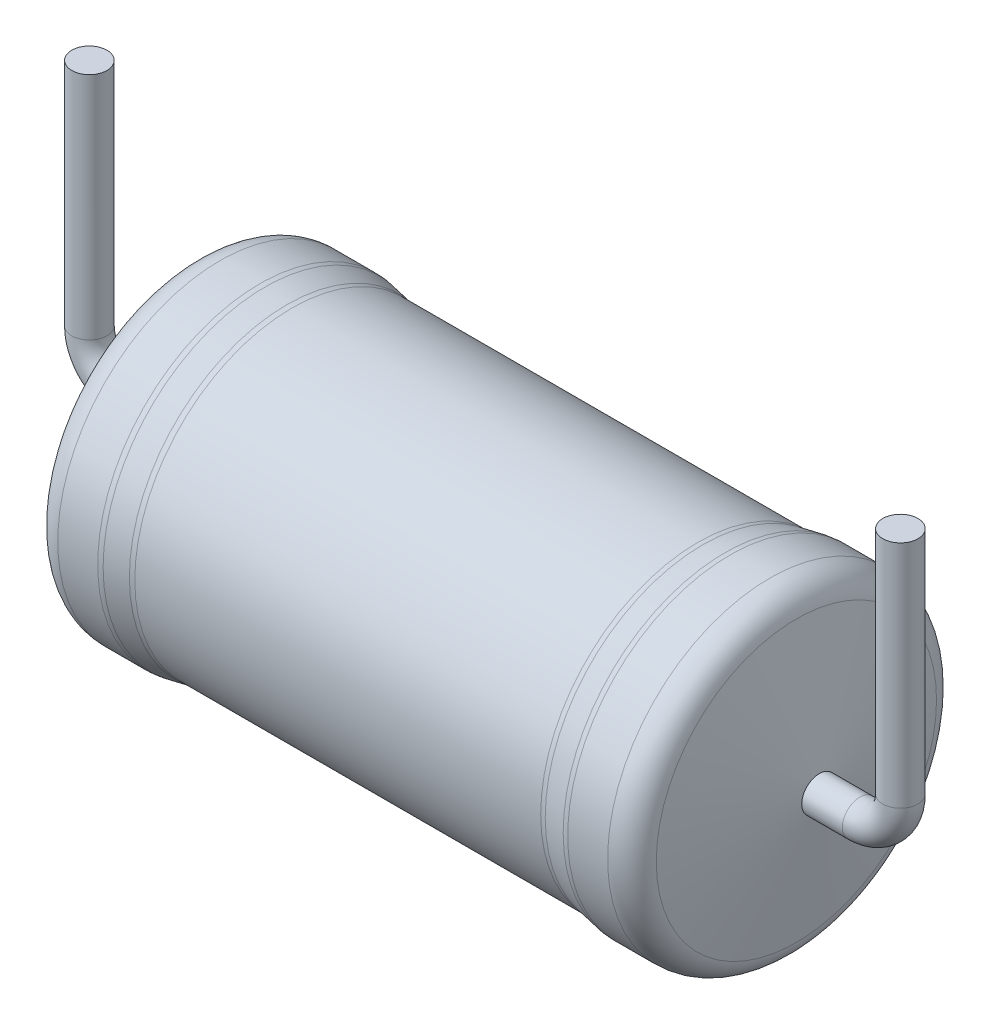
ISO-10303-21;
HEADER;
FILE_DESCRIPTION(('STEP AP214'),'2;1');
FILE_NAME('part.step','',(''),(''),'','','');
FILE_SCHEMA(('AUTOMOTIVE_DESIGN { 1 0 10303 214 1 1 1 1 }'));
ENDSEC;
DATA;
#1=APPLICATION_CONTEXT('core data for automotive mechanical design processes');
#2=APPLICATION_PROTOCOL_DEFINITION('international standard','automotive_design',2000,#1);
#3=PRODUCT_CONTEXT('',#1,'mechanical');
#4=PRODUCT('Part','Part','',(#3));
#5=PRODUCT_RELATED_PRODUCT_CATEGORY('part','',(#4));
#6=PRODUCT_DEFINITION_FORMATION('','',#4);
#7=PRODUCT_DEFINITION_CONTEXT('part definition',#1,'design');
#8=PRODUCT_DEFINITION('design','',#6,#7);
#9=PRODUCT_DEFINITION_SHAPE('','',#8);
#10=(LENGTH_UNIT() NAMED_UNIT(*) SI_UNIT(.MILLI.,.METRE.));
#11=(NAMED_UNIT(*) PLANE_ANGLE_UNIT() SI_UNIT($,.RADIAN.));
#12=(NAMED_UNIT(*) SI_UNIT($,.STERADIAN.) SOLID_ANGLE_UNIT());
#13=UNCERTAINTY_MEASURE_WITH_UNIT(LENGTH_MEASURE(1.E-05),#10,'distance_accuracy_value','');
#14=(GEOMETRIC_REPRESENTATION_CONTEXT(3) GLOBAL_UNCERTAINTY_ASSIGNED_CONTEXT((#13)) GLOBAL_UNIT_ASSIGNED_CONTEXT((#10,
#11,#12)) REPRESENTATION_CONTEXT('',''));
#15=CARTESIAN_POINT('',(0.,0.,0.));
#16=DIRECTION('',(0.,0.,1.));
#17=DIRECTION('',(1.,0.,0.));
#18=AXIS2_PLACEMENT_3D('',#15,#16,#17);
#19=CARTESIAN_POINT('',(6.,0.,0.));
#20=DIRECTION('',(-1.,0.,0.));
#21=DIRECTION('',(0.,0.,1.));
#22=AXIS2_PLACEMENT_3D('',#19,#20,#21);
#23=CONICAL_SURFACE('',#22,0.325,1.38601271082507);
#24=CARTESIAN_POINT('',(5.5762865572415,0.,0.));
#25=DIRECTION('',(1.,0.,0.));
#26=DIRECTION('',(0.,0.,-1.));
#27=AXIS2_PLACEMENT_3D('',#24,#25,#26);
#28=CIRCLE('',#27,2.591866918758);
#29=CARTESIAN_POINT('',(5.5762865572415,0.,2.59186691875801));
#30=VERTEX_POINT('',#29);
#31=EDGE_CURVE('E11',#30,#30,#28,.T.);
#32=CARTESIAN_POINT('',(6.,0.,0.));
#33=DIRECTION('',(-1.,0.,0.));
#34=DIRECTION('',(0.,0.,1.));
#35=AXIS2_PLACEMENT_3D('',#32,#33,#34);
#36=CIRCLE('',#35,0.325);
#37=CARTESIAN_POINT('',(6.,0.,0.324999999999998));
#38=VERTEX_POINT('',#37);
#39=EDGE_CURVE('E61',#38,#38,#36,.T.);
#40=CARTESIAN_POINT('',(5.5762865572415,0.,2.59186691875801));
#41=CARTESIAN_POINT('',(5.5807002389369,0.,2.56825372168761));
#42=CARTESIAN_POINT('',(5.5851139206323,0.,2.54464052461722));
#43=CARTESIAN_POINT('',(5.5939412840231,0.,2.49741413047642));
#44=CARTESIAN_POINT('',(5.5983549657185,0.,2.47380093340603));
#45=CARTESIAN_POINT('',(5.6071823291093,0.,2.42657453926524));
#46=CARTESIAN_POINT('',(5.61159601080471,0.,2.40296134219484));
#47=CARTESIAN_POINT('',(5.62042337419551,0.,2.35573494805405));
#48=CARTESIAN_POINT('',(5.62483705589091,0.,2.33212175098365));
#49=CARTESIAN_POINT('',(5.63366441928171,0.,2.28489535684286));
#50=CARTESIAN_POINT('',(5.63807810097711,0.,2.26128215977246));
#51=CARTESIAN_POINT('',(5.64690546436791,0.,2.21405576563167));
#52=CARTESIAN_POINT('',(5.65131914606332,0.,2.19044256856128));
#53=CARTESIAN_POINT('',(5.66014650945412,0.,2.14321617442048));
#54=CARTESIAN_POINT('',(5.66456019114952,0.,2.11960297735009));
#55=CARTESIAN_POINT('',(5.67338755454032,0.,2.0723765832093));
#56=CARTESIAN_POINT('',(5.67780123623572,0.,2.0487633861389));
#57=CARTESIAN_POINT('',(5.68662859962652,0.,2.00153699199811));
#58=CARTESIAN_POINT('',(5.69104228132192,0.,1.97792379492771));
#59=CARTESIAN_POINT('',(5.69986964471273,0.,1.93069740078692));
#60=CARTESIAN_POINT('',(5.70428332640813,0.,1.90708420371652));
#61=CARTESIAN_POINT('',(5.71311068979893,0.,1.85985780957573));
#62=CARTESIAN_POINT('',(5.71752437149433,0.,1.83624461250534));
#63=CARTESIAN_POINT('',(5.72635173488513,0.,1.78901821836455));
#64=CARTESIAN_POINT('',(5.73076541658053,0.,1.76540502129415));
#65=CARTESIAN_POINT('',(5.73959277997134,0.,1.71817862715336));
#66=CARTESIAN_POINT('',(5.74400646166674,0.,1.69456543008296));
#67=CARTESIAN_POINT('',(5.75283382505754,0.,1.64733903594217));
#68=CARTESIAN_POINT('',(5.75724750675294,0.,1.62372583887177));
#69=CARTESIAN_POINT('',(5.76607487014374,0.,1.57649944473098));
#70=CARTESIAN_POINT('',(5.77048855183915,0.,1.55288624766059));
#71=CARTESIAN_POINT('',(5.77931591522995,0.,1.50565985351979));
#72=CARTESIAN_POINT('',(5.78372959692535,0.,1.4820466564494));
#73=CARTESIAN_POINT('',(5.79255696031615,0.,1.43482026230861));
#74=CARTESIAN_POINT('',(5.79697064201155,0.,1.41120706523821));
#75=CARTESIAN_POINT('',(5.80579800540235,0.,1.36398067109742));
#76=CARTESIAN_POINT('',(5.81021168709776,0.,1.34036747402702));
#77=CARTESIAN_POINT('',(5.81903905048856,0.,1.29314107988623));
#78=CARTESIAN_POINT('',(5.82345273218396,0.,1.26952788281583));
#79=CARTESIAN_POINT('',(5.83228009557476,0.,1.22230148867504));
#80=CARTESIAN_POINT('',(5.83669377727016,0.,1.19868829160465));
#81=CARTESIAN_POINT('',(5.84552114066097,0.,1.15146189746386));
#82=CARTESIAN_POINT('',(5.84993482235637,0.,1.12784870039346));
#83=CARTESIAN_POINT('',(5.85876218574717,0.,1.08062230625267));
#84=CARTESIAN_POINT('',(5.86317586744257,0.,1.05700910918227));
#85=CARTESIAN_POINT('',(5.87200323083337,0.,1.00978271504148));
#86=CARTESIAN_POINT('',(5.87641691252877,0.,0.986169517971084));
#87=CARTESIAN_POINT('',(5.88524427591958,0.,0.938943123830292));
#88=CARTESIAN_POINT('',(5.88965795761498,0.,0.915329926759896));
#89=CARTESIAN_POINT('',(5.89848532100578,0.,0.868103532619104));
#90=CARTESIAN_POINT('',(5.90289900270118,0.,0.844490335548708));
#91=CARTESIAN_POINT('',(5.91172636609198,0.,0.797263941407916));
#92=CARTESIAN_POINT('',(5.91614004778738,0.,0.77365074433752));
#93=CARTESIAN_POINT('',(5.92496741117818,0.,0.726424350196728));
#94=CARTESIAN_POINT('',(5.92938109287359,0.,0.702811153126333));
#95=CARTESIAN_POINT('',(5.93820845626439,0.,0.655584758985541));
#96=CARTESIAN_POINT('',(5.94262213795979,0.,0.631971561915145));
#97=CARTESIAN_POINT('',(5.95144950135059,0.,0.584745167774353));
#98=CARTESIAN_POINT('',(5.95586318304599,0.,0.561131970703957));
#99=CARTESIAN_POINT('',(5.96469054643679,0.,0.513905576563165));
#100=CARTESIAN_POINT('',(5.9691042281322,0.,0.490292379492769));
#101=CARTESIAN_POINT('',(5.977931591523,0.,0.443065985351977));
#102=CARTESIAN_POINT('',(5.9823452732184,0.,0.419452788281582));
#103=CARTESIAN_POINT('',(5.9911726366092,0.,0.37222639414079));
#104=CARTESIAN_POINT('',(5.9955863183046,0.,0.348613197070394));
#105=CARTESIAN_POINT('',(6.,0.,0.324999999999998));
#106=B_SPLINE_CURVE_WITH_KNOTS('',3,(#40,#41,#42,#43,#44,#45,#46,#47,#48,#49,#50,#51,#52,#53,
#54,#55,#56,#57,#58,#59,#60,#61,#62,#63,#64,#65,#66,#67,#68,#69,#70,#71,#72,#73,#74,#75,#76,#77,
#78,#79,#80,#81,#82,#83,#84,#85,#86,#87,#88,#89,#90,#91,#92,#93,#94,#95,#96,#97,#98,#99,#100,
#101,#102,#103,#104,#105),.UNSPECIFIED.,.F.,.F.,(4,2,2,2,2,2,2,2,2,2,2,2,2,2,2,2,2,2,2,2,2,2,2,
2,2,2,2,2,2,2,2,2,4),(0.,0.0720664482123484,0.144132896424697,0.216199344637045,
0.288265792849393,0.360332241061741,0.43239868927409,0.504465137486438,0.576531585698786,
0.648598033911134,0.720664482123483,0.79273093033583,0.864797378548179,0.936863826760527,
1.00893027497288,1.08099672318522,1.15306317139757,1.22512961960992,1.29719606782227,
1.36926251603462,1.44132896424696,1.51339541245931,1.58546186067166,1.65752830888401,
1.72959475709636,1.80166120530871,1.87372765352105,1.9457941017334,2.01786054994575,
2.0899269981581,2.16199344637045,2.23405989458279,2.30612634279514),.UNSPECIFIED.);
#107=EDGE_CURVE('BSEAM39',#30,#38,#106,.T.);
#108=ORIENTED_EDGE('',*,*,#31,.T.);
#109=ORIENTED_EDGE('',*,*,#39,.T.);
#110=ORIENTED_EDGE('',*,*,#107,.T.);
#111=ORIENTED_EDGE('',*,*,#107,.F.);
#112=EDGE_LOOP('',(#108,#110,#109,#111));
#113=FACE_BOUND('',#112,.T.);
#114=ADVANCED_FACE('F39',(#113),#23,.T.);
#115=CARTESIAN_POINT('',(0.,0.,0.));
#116=DIRECTION('',(-1.,0.,0.));
#117=DIRECTION('',(0.,0.,1.));
#118=AXIS2_PLACEMENT_3D('',#115,#116,#117);
#119=CYLINDRICAL_SURFACE('',#118,3.);
#120=CARTESIAN_POINT('',(4.34632780090896,0.,0.));
#121=DIRECTION('',(1.,0.,0.));
#122=DIRECTION('',(0.,0.,-1.));
#123=AXIS2_PLACEMENT_3D('',#120,#121,#122);
#124=CIRCLE('',#123,3.);
#125=CARTESIAN_POINT('',(4.34632780090896,0.,-3.));
#126=VERTEX_POINT('',#125);
#127=EDGE_CURVE('E48',#126,#126,#124,.T.);
#128=ORIENTED_EDGE('',*,*,#127,.T.);
#129=EDGE_LOOP('',(#128));
#130=FACE_BOUND('',#129,.T.);
#131=CARTESIAN_POINT('',(5.08479854188618,0.,0.));
#132=DIRECTION('',(1.,0.,0.));
#133=DIRECTION('',(0.,0.,-1.));
#134=AXIS2_PLACEMENT_3D('',#131,#132,#133);
#135=CIRCLE('',#134,3.);
#136=CARTESIAN_POINT('',(5.08479854188618,0.,-3.));
#137=VERTEX_POINT('',#136);
#138=EDGE_CURVE('E113',#137,#137,#135,.F.);
#139=ORIENTED_EDGE('',*,*,#138,.T.);
#140=EDGE_LOOP('',(#139));
#141=FACE_BOUND('',#140,.T.);
#142=ADVANCED_FACE('F120',(#130,#141),#119,.T.);
#143=CARTESIAN_POINT('',(4.3,0.,0.));
#144=DIRECTION('',(1.,0.,0.));
#145=DIRECTION('',(0.,0.,-1.));
#146=AXIS2_PLACEMENT_3D('',#143,#144,#145);
#147=CONICAL_SURFACE('',#146,3.,0.184783615969826);
#148=CARTESIAN_POINT('',(3.84553911784905,0.,0.));
#149=DIRECTION('',(1.,0.,0.));
#150=DIRECTION('',(0.,0.,-1.));
#151=AXIS2_PLACEMENT_3D('',#148,#149,#150);
#152=CIRCLE('',#151,2.91505404071945);
#153=CARTESIAN_POINT('',(3.84553911784905,0.,-2.91505404071945));
#154=VERTEX_POINT('',#153);
#155=EDGE_CURVE('E109',#154,#154,#152,.T.);
#156=ORIENTED_EDGE('',*,*,#155,.T.);
#157=EDGE_LOOP('',(#156));
#158=FACE_BOUND('',#157,.T.);
#159=CARTESIAN_POINT('',(4.25446088215096,0.,0.));
#160=DIRECTION('',(-1.,0.,0.));
#161=DIRECTION('',(0.,0.,1.));
#162=AXIS2_PLACEMENT_3D('',#159,#160,#161);
#163=CIRCLE('',#162,2.99148801535532);
#164=CARTESIAN_POINT('',(4.25446088215096,0.,2.99148801535532));
#165=VERTEX_POINT('',#164);
#166=EDGE_CURVE('E105',#165,#165,#163,.T.);
#167=ORIENTED_EDGE('',*,*,#166,.T.);
#168=EDGE_LOOP('',(#167));
#169=FACE_BOUND('',#168,.T.);
#170=ADVANCED_FACE('F129',(#158,#169),#147,.T.);
#171=CARTESIAN_POINT('',(0.,0.,0.));
#172=DIRECTION('',(-1.,0.,0.));
#173=DIRECTION('',(0.,0.,1.));
#174=AXIS2_PLACEMENT_3D('',#171,#172,#173);
#175=CYLINDRICAL_SURFACE('',#174,2.90654205607477);
#176=CARTESIAN_POINT('',(-3.75367219909104,0.,0.));
#177=DIRECTION('',(-1.,0.,0.));
#178=DIRECTION('',(0.,0.,1.));
#179=AXIS2_PLACEMENT_3D('',#176,#177,#178);
#180=CIRCLE('',#179,2.90654205607477);
#181=CARTESIAN_POINT('',(-3.75367219909104,0.,2.90654205607477));
#182=VERTEX_POINT('',#181);
#183=EDGE_CURVE('E101',#182,#182,#180,.F.);
#184=ORIENTED_EDGE('',*,*,#183,.T.);
#185=EDGE_LOOP('',(#184));
#186=FACE_BOUND('',#185,.T.);
#187=CARTESIAN_POINT('',(3.75367219909104,0.,0.));
#188=DIRECTION('',(-1.,0.,0.));
#189=DIRECTION('',(0.,0.,1.));
#190=AXIS2_PLACEMENT_3D('',#187,#188,#189);
#191=CIRCLE('',#190,2.90654205607477);
#192=CARTESIAN_POINT('',(3.75367219909104,0.,2.90654205607477));
#193=VERTEX_POINT('',#192);
#194=EDGE_CURVE('E97',#193,#193,#191,.T.);
#195=ORIENTED_EDGE('',*,*,#194,.T.);
#196=EDGE_LOOP('',(#195));
#197=FACE_BOUND('',#196,.T.);
#198=ADVANCED_FACE('F131',(#186,#197),#175,.T.);
#199=CARTESIAN_POINT('',(-3.8,0.,0.));
#200=DIRECTION('',(-1.,0.,0.));
#201=DIRECTION('',(0.,0.,1.));
#202=AXIS2_PLACEMENT_3D('',#199,#200,#201);
#203=CONICAL_SURFACE('',#202,2.90654205607477,0.184783615969825);
#204=CARTESIAN_POINT('',(-4.25446088215095,0.,0.));
#205=DIRECTION('',(1.,0.,0.));
#206=DIRECTION('',(0.,0.,-1.));
#207=AXIS2_PLACEMENT_3D('',#204,#205,#206);
#208=CIRCLE('',#207,2.99148801535532);
#209=CARTESIAN_POINT('',(-4.25446088215095,0.,-2.99148801535532));
#210=VERTEX_POINT('',#209);
#211=EDGE_CURVE('E93',#210,#210,#208,.T.);
#212=ORIENTED_EDGE('',*,*,#211,.T.);
#213=EDGE_LOOP('',(#212));
#214=FACE_BOUND('',#213,.T.);
#215=CARTESIAN_POINT('',(-3.84553911784904,0.,0.));
#216=DIRECTION('',(-1.,0.,0.));
#217=DIRECTION('',(0.,0.,1.));
#218=AXIS2_PLACEMENT_3D('',#215,#216,#217);
#219=CIRCLE('',#218,2.91505404071945);
#220=CARTESIAN_POINT('',(-3.84553911784904,0.,2.91505404071945));
#221=VERTEX_POINT('',#220);
#222=EDGE_CURVE('E89',#221,#221,#219,.T.);
#223=ORIENTED_EDGE('',*,*,#222,.T.);
#224=EDGE_LOOP('',(#223));
#225=FACE_BOUND('',#224,.T.);
#226=ADVANCED_FACE('F138',(#214,#225),#203,.T.);
#227=CARTESIAN_POINT('',(0.,0.,0.));
#228=DIRECTION('',(-1.,0.,0.));
#229=DIRECTION('',(0.,0.,1.));
#230=AXIS2_PLACEMENT_3D('',#227,#228,#229);
#231=CYLINDRICAL_SURFACE('',#230,3.);
#232=CARTESIAN_POINT('',(-5.08479854188617,0.,0.));
#233=DIRECTION('',(1.,0.,0.));
#234=DIRECTION('',(0.,0.,-1.));
#235=AXIS2_PLACEMENT_3D('',#232,#233,#234);
#236=CIRCLE('',#235,3.);
#237=CARTESIAN_POINT('',(-5.08479854188617,0.,-3.));
#238=VERTEX_POINT('',#237);
#239=EDGE_CURVE('E85',#238,#238,#236,.T.);
#240=ORIENTED_EDGE('',*,*,#239,.T.);
#241=EDGE_LOOP('',(#240));
#242=FACE_BOUND('',#241,.T.);
#243=CARTESIAN_POINT('',(-4.34632780090896,0.,0.));
#244=DIRECTION('',(1.,0.,0.));
#245=DIRECTION('',(0.,0.,-1.));
#246=AXIS2_PLACEMENT_3D('',#243,#244,#245);
#247=CIRCLE('',#246,3.);
#248=CARTESIAN_POINT('',(-4.34632780090896,0.,-3.));
#249=VERTEX_POINT('',#248);
#250=EDGE_CURVE('E81',#249,#249,#247,.F.);
#251=ORIENTED_EDGE('',*,*,#250,.T.);
#252=EDGE_LOOP('',(#251));
#253=FACE_BOUND('',#252,.T.);
#254=ADVANCED_FACE('F285',(#242,#253),#231,.T.);
#255=CARTESIAN_POINT('',(-5.5,0.,0.));
#256=DIRECTION('',(1.,0.,0.));
#257=DIRECTION('',(0.,0.,-1.));
#258=AXIS2_PLACEMENT_3D('',#255,#256,#257);
#259=CONICAL_SURFACE('',#258,3.,1.38601271082507);
#260=CARTESIAN_POINT('',(-5.5762865572415,0.,0.));
#261=DIRECTION('',(-1.,0.,0.));
#262=DIRECTION('',(0.,0.,1.));
#263=AXIS2_PLACEMENT_3D('',#260,#261,#262);
#264=CIRCLE('',#263,2.591866918758);
#265=CARTESIAN_POINT('',(-5.57628655724149,0.,-2.591866918758));
#266=VERTEX_POINT('',#265);
#267=EDGE_CURVE('E77',#266,#266,#264,.T.);
#268=CARTESIAN_POINT('',(-6.,0.,0.));
#269=DIRECTION('',(-1.,0.,0.));
#270=DIRECTION('',(0.,0.,1.));
#271=AXIS2_PLACEMENT_3D('',#268,#269,#270);
#272=CIRCLE('',#271,0.325);
#273=CARTESIAN_POINT('',(-6.,0.,-0.325000000000002));
#274=VERTEX_POINT('',#273);
#275=EDGE_CURVE('E67',#274,#274,#272,.T.);
#276=CARTESIAN_POINT('',(-5.57628655724149,0.,-2.591866918758));
#277=CARTESIAN_POINT('',(-5.58070023893689,0.,-2.56825372168761));
#278=CARTESIAN_POINT('',(-5.5851139206323,0.,-2.54464052461721));
#279=CARTESIAN_POINT('',(-5.5939412840231,0.,-2.49741413047642));
#280=CARTESIAN_POINT('',(-5.5983549657185,0.,-2.47380093340602));
#281=CARTESIAN_POINT('',(-5.6071823291093,0.,-2.42657453926523));
#282=CARTESIAN_POINT('',(-5.6115960108047,0.,-2.40296134219484));
#283=CARTESIAN_POINT('',(-5.62042337419551,0.,-2.35573494805405));
#284=CARTESIAN_POINT('',(-5.62483705589091,0.,-2.33212175098365));
#285=CARTESIAN_POINT('',(-5.63366441928171,0.,-2.28489535684286));
#286=CARTESIAN_POINT('',(-5.63807810097711,0.,-2.26128215977246));
#287=CARTESIAN_POINT('',(-5.64690546436791,0.,-2.21405576563167));
#288=CARTESIAN_POINT('',(-5.65131914606331,0.,-2.19044256856127));
#289=CARTESIAN_POINT('',(-5.66014650945412,0.,-2.14321617442048));
#290=CARTESIAN_POINT('',(-5.66456019114952,0.,-2.11960297735009));
#291=CARTESIAN_POINT('',(-5.67338755454032,0.,-2.07237658320929));
#292=CARTESIAN_POINT('',(-5.67780123623572,0.,-2.0487633861389));
#293=CARTESIAN_POINT('',(-5.68662859962652,0.,-2.00153699199811));
#294=CARTESIAN_POINT('',(-5.69104228132192,0.,-1.97792379492771));
#295=CARTESIAN_POINT('',(-5.69986964471273,0.,-1.93069740078692));
#296=CARTESIAN_POINT('',(-5.70428332640813,0.,-1.90708420371652));
#297=CARTESIAN_POINT('',(-5.71311068979893,0.,-1.85985780957573));
#298=CARTESIAN_POINT('',(-5.71752437149433,0.,-1.83624461250534));
#299=CARTESIAN_POINT('',(-5.72635173488513,0.,-1.78901821836454));
#300=CARTESIAN_POINT('',(-5.73076541658053,0.,-1.76540502129415));
#301=CARTESIAN_POINT('',(-5.73959277997133,0.,-1.71817862715336));
#302=CARTESIAN_POINT('',(-5.74400646166674,0.,-1.69456543008296));
#303=CARTESIAN_POINT('',(-5.75283382505754,0.,-1.64733903594217));
#304=CARTESIAN_POINT('',(-5.75724750675294,0.,-1.62372583887177));
#305=CARTESIAN_POINT('',(-5.76607487014374,0.,-1.57649944473098));
#306=CARTESIAN_POINT('',(-5.77048855183914,0.,-1.55288624766059));
#307=CARTESIAN_POINT('',(-5.77931591522994,0.,-1.50565985351979));
#308=CARTESIAN_POINT('',(-5.78372959692535,0.,-1.4820466564494));
#309=CARTESIAN_POINT('',(-5.79255696031615,0.,-1.43482026230861));
#310=CARTESIAN_POINT('',(-5.79697064201155,0.,-1.41120706523821));
#311=CARTESIAN_POINT('',(-5.80579800540235,0.,-1.36398067109742));
#312=CARTESIAN_POINT('',(-5.81021168709775,0.,-1.34036747402702));
#313=CARTESIAN_POINT('',(-5.81903905048855,0.,-1.29314107988623));
#314=CARTESIAN_POINT('',(-5.82345273218396,0.,-1.26952788281584));
#315=CARTESIAN_POINT('',(-5.83228009557476,0.,-1.22230148867504));
#316=CARTESIAN_POINT('',(-5.83669377727016,0.,-1.19868829160465));
#317=CARTESIAN_POINT('',(-5.84552114066096,0.,-1.15146189746386));
#318=CARTESIAN_POINT('',(-5.84993482235636,0.,-1.12784870039346));
#319=CARTESIAN_POINT('',(-5.85876218574716,0.,-1.08062230625267));
#320=CARTESIAN_POINT('',(-5.86317586744257,0.,-1.05700910918227));
#321=CARTESIAN_POINT('',(-5.87200323083337,0.,-1.00978271504148));
#322=CARTESIAN_POINT('',(-5.87641691252877,0.,-0.986169517971086));
#323=CARTESIAN_POINT('',(-5.88524427591957,0.,-0.938943123830294));
#324=CARTESIAN_POINT('',(-5.88965795761497,0.,-0.915329926759898));
#325=CARTESIAN_POINT('',(-5.89848532100577,0.,-0.868103532619106));
#326=CARTESIAN_POINT('',(-5.90289900270117,0.,-0.84449033554871));
#327=CARTESIAN_POINT('',(-5.91172636609198,0.,-0.797263941407919));
#328=CARTESIAN_POINT('',(-5.91614004778738,0.,-0.773650744337523));
#329=CARTESIAN_POINT('',(-5.92496741117818,0.,-0.726424350196732));
#330=CARTESIAN_POINT('',(-5.92938109287358,0.,-0.702811153126336));
#331=CARTESIAN_POINT('',(-5.93820845626438,0.,-0.655584758985544));
#332=CARTESIAN_POINT('',(-5.94262213795979,0.,-0.631971561915148));
#333=CARTESIAN_POINT('',(-5.95144950135059,0.,-0.584745167774356));
#334=CARTESIAN_POINT('',(-5.95586318304599,0.,-0.561131970703961));
#335=CARTESIAN_POINT('',(-5.96469054643679,0.,-0.513905576563169));
#336=CARTESIAN_POINT('',(-5.96910422813219,0.,-0.490292379492773));
#337=CARTESIAN_POINT('',(-5.97793159152299,0.,-0.443065985351981));
#338=CARTESIAN_POINT('',(-5.9823452732184,0.,-0.419452788281585));
#339=CARTESIAN_POINT('',(-5.9911726366092,0.,-0.372226394140794));
#340=CARTESIAN_POINT('',(-5.9955863183046,0.,-0.348613197070398));
#341=CARTESIAN_POINT('',(-6.,0.,-0.325000000000002));
#342=B_SPLINE_CURVE_WITH_KNOTS('',3,(#276,#277,#278,#279,#280,#281,#282,#283,#284,#285,#286,
#287,#288,#289,#290,#291,#292,#293,#294,#295,#296,#297,#298,#299,#300,#301,#302,#303,#304,#305,
#306,#307,#308,#309,#310,#311,#312,#313,#314,#315,#316,#317,#318,#319,#320,#321,#322,#323,#324,
#325,#326,#327,#328,#329,#330,#331,#332,#333,#334,#335,#336,#337,#338,#339,#340,#341),
.UNSPECIFIED.,.F.,.F.,(4,2,2,2,2,2,2,2,2,2,2,2,2,2,2,2,2,2,2,2,2,2,2,2,2,2,2,2,2,2,2,2,4),(0.,
0.0720664482123477,0.144132896424696,0.216199344637043,0.288265792849392,0.36033224106174,
0.432398689274087,0.504465137486436,0.576531585698784,0.648598033911131,0.720664482123479,
0.792730930335827,0.864797378548175,0.936863826760523,1.00893027497287,1.08099672318522,
1.15306317139757,1.22512961960992,1.29719606782226,1.36926251603461,1.44132896424696,
1.51339541245931,1.58546186067165,1.657528308884,1.72959475709635,1.8016612053087,
1.87372765352105,1.94579410173339,2.01786054994574,2.08992699815809,2.16199344637044,
2.23405989458279,2.30612634279513),.UNSPECIFIED.);
#343=EDGE_CURVE('BSEAM153',#266,#274,#342,.T.);
#344=ORIENTED_EDGE('',*,*,#267,.T.);
#345=ORIENTED_EDGE('',*,*,#275,.F.);
#346=ORIENTED_EDGE('',*,*,#343,.T.);
#347=ORIENTED_EDGE('',*,*,#343,.F.);
#348=EDGE_LOOP('',(#344,#346,#345,#347));
#349=FACE_BOUND('',#348,.T.);
#350=ADVANCED_FACE('F153',(#349),#259,.T.);
#351=CARTESIAN_POINT('',(-5.08479854188617,0.,0.));
#352=DIRECTION('',(1.,0.,0.));
#353=DIRECTION('',(0.,0.,-1.));
#354=AXIS2_PLACEMENT_3D('',#351,#352,#353);
#355=TOROIDAL_SURFACE('',#354,2.5,0.5);
#356=ORIENTED_EDGE('',*,*,#239,.F.);
#357=EDGE_LOOP('',(#356));
#358=FACE_BOUND('',#357,.T.);
#359=ORIENTED_EDGE('',*,*,#267,.F.);
#360=EDGE_LOOP('',(#359));
#361=FACE_BOUND('',#360,.T.);
#362=ADVANCED_FACE('F149',(#358,#361),#355,.T.);
#363=CARTESIAN_POINT('',(-4.34632780090896,0.,0.));
#364=DIRECTION('',(1.,0.,0.));
#365=DIRECTION('',(0.,0.,-1.));
#366=AXIS2_PLACEMENT_3D('',#363,#364,#365);
#367=TOROIDAL_SURFACE('',#366,2.5,0.5);
#368=ORIENTED_EDGE('',*,*,#211,.F.);
#369=EDGE_LOOP('',(#368));
#370=FACE_BOUND('',#369,.T.);
#371=ORIENTED_EDGE('',*,*,#250,.F.);
#372=EDGE_LOOP('',(#371));
#373=FACE_BOUND('',#372,.T.);
#374=ADVANCED_FACE('F152',(#370,#373),#367,.T.);
#375=CARTESIAN_POINT('',(-3.75367219909104,0.,0.));
#376=DIRECTION('',(-1.,0.,0.));
#377=DIRECTION('',(0.,0.,1.));
#378=AXIS2_PLACEMENT_3D('',#375,#376,#377);
#379=TOROIDAL_SURFACE('',#378,3.40654205607477,0.5);
#380=ORIENTED_EDGE('',*,*,#183,.F.);
#381=EDGE_LOOP('',(#380));
#382=FACE_BOUND('',#381,.T.);
#383=ORIENTED_EDGE('',*,*,#222,.F.);
#384=EDGE_LOOP('',(#383));
#385=FACE_BOUND('',#384,.T.);
#386=ADVANCED_FACE('F157',(#382,#385),#379,.F.);
#387=CARTESIAN_POINT('',(3.75367219909104,0.,0.));
#388=DIRECTION('',(-1.,0.,0.));
#389=DIRECTION('',(0.,0.,1.));
#390=AXIS2_PLACEMENT_3D('',#387,#388,#389);
#391=TOROIDAL_SURFACE('',#390,3.40654205607477,0.5);
#392=ORIENTED_EDGE('',*,*,#155,.F.);
#393=EDGE_LOOP('',(#392));
#394=FACE_BOUND('',#393,.T.);
#395=ORIENTED_EDGE('',*,*,#194,.F.);
#396=EDGE_LOOP('',(#395));
#397=FACE_BOUND('',#396,.T.);
#398=ADVANCED_FACE('F126',(#394,#397),#391,.F.);
#399=CARTESIAN_POINT('',(4.34632780090896,0.,0.));
#400=DIRECTION('',(1.,0.,0.));
#401=DIRECTION('',(0.,0.,-1.));
#402=AXIS2_PLACEMENT_3D('',#399,#400,#401);
#403=TOROIDAL_SURFACE('',#402,2.5,0.5);
#404=ORIENTED_EDGE('',*,*,#127,.F.);
#405=EDGE_LOOP('',(#404));
#406=FACE_BOUND('',#405,.T.);
#407=ORIENTED_EDGE('',*,*,#166,.F.);
#408=EDGE_LOOP('',(#407));
#409=FACE_BOUND('',#408,.T.);
#410=ADVANCED_FACE('F123',(#406,#409),#403,.T.);
#411=CARTESIAN_POINT('',(5.08479854188618,0.,0.));
#412=DIRECTION('',(1.,0.,0.));
#413=DIRECTION('',(0.,0.,-1.));
#414=AXIS2_PLACEMENT_3D('',#411,#412,#413);
#415=TOROIDAL_SURFACE('',#414,2.5,0.5);
#416=ORIENTED_EDGE('',*,*,#31,.F.);
#417=EDGE_LOOP('',(#416));
#418=FACE_BOUND('',#417,.T.);
#419=ORIENTED_EDGE('',*,*,#138,.F.);
#420=EDGE_LOOP('',(#419));
#421=FACE_BOUND('',#420,.T.);
#422=ADVANCED_FACE('F41',(#418,#421),#415,.T.);
#423=CARTESIAN_POINT('',(-7.5,5.,0.));
#424=DIRECTION('',(0.,-1.,0.));
#425=DIRECTION('',(0.,0.,-1.));
#426=AXIS2_PLACEMENT_3D('',#423,#424,#425);
#427=PLANE('',#426);
#428=CARTESIAN_POINT('',(-7.5,5.,0.));
#429=DIRECTION('',(0.,-1.,0.));
#430=DIRECTION('',(0.,0.,-1.));
#431=AXIS2_PLACEMENT_3D('',#428,#429,#430);
#432=CIRCLE('',#431,0.325);
#433=CARTESIAN_POINT('',(-7.5,5.,-0.325));
#434=VERTEX_POINT('',#433);
#435=EDGE_CURVE('E53',#434,#434,#432,.T.);
#436=ORIENTED_EDGE('',*,*,#435,.F.);
#437=EDGE_LOOP('',(#436));
#438=FACE_BOUND('',#437,.T.);
#439=ADVANCED_FACE('F182',(#438),#427,.F.);
#440=CARTESIAN_POINT('',(-7.5,5.,0.));
#441=DIRECTION('',(0.,-1.,0.));
#442=DIRECTION('',(0.,0.,-1.));
#443=AXIS2_PLACEMENT_3D('',#440,#441,#442);
#444=CYLINDRICAL_SURFACE('',#443,0.325);
#445=CARTESIAN_POINT('',(-7.5,0.749999999999997,0.));
#446=DIRECTION('',(0.,-1.,0.));
#447=DIRECTION('',(0.,0.,-1.));
#448=AXIS2_PLACEMENT_3D('',#445,#446,#447);
#449=CIRCLE('',#448,0.325);
#450=CARTESIAN_POINT('',(-7.825,0.749999999999997,0.));
#451=VERTEX_POINT('',#450);
#452=EDGE_CURVE('E351',#451,#451,#449,.T.);
#453=ORIENTED_EDGE('',*,*,#452,.F.);
#454=EDGE_LOOP('',(#453));
#455=FACE_BOUND('',#454,.T.);
#456=ORIENTED_EDGE('',*,*,#435,.T.);
#457=EDGE_LOOP('',(#456));
#458=FACE_BOUND('',#457,.T.);
#459=ADVANCED_FACE('F189',(#455,#458),#444,.T.);
#460=CARTESIAN_POINT('',(-6.75,0.749999999999998,0.));
#461=DIRECTION('',(0.,0.,1.));
#462=DIRECTION('',(1.,0.,0.));
#463=AXIS2_PLACEMENT_3D('',#460,#461,#462);
#464=TOROIDAL_SURFACE('',#463,0.750000000000001,0.325);
#465=CARTESIAN_POINT('',(-6.75,0.,0.));
#466=DIRECTION('',(1.,0.,0.));
#467=DIRECTION('',(0.,0.,-1.));
#468=AXIS2_PLACEMENT_3D('',#465,#466,#467);
#469=CIRCLE('',#468,0.325);
#470=CARTESIAN_POINT('',(-6.74999999999999,-0.325000000000002,0.));
#471=VERTEX_POINT('',#470);
#472=EDGE_CURVE('E348',#471,#471,#469,.T.);
#473=CARTESIAN_POINT('',(-6.75,0.749999999999998,0.));
#474=DIRECTION('',(0.,0.,1.));
#475=DIRECTION('',(1.,0.,0.));
#476=AXIS2_PLACEMENT_3D('',#473,#474,#475);
#477=CIRCLE('',#476,1.075);
#478=EDGE_CURVE('',#451,#471,#477,.T.);
#479=ORIENTED_EDGE('',*,*,#452,.T.);
#480=ORIENTED_EDGE('',*,*,#472,.F.);
#481=ORIENTED_EDGE('',*,*,#478,.T.);
#482=ORIENTED_EDGE('',*,*,#478,.F.);
#483=EDGE_LOOP('',(#479,#481,#480,#482));
#484=FACE_BOUND('',#483,.T.);
#485=ADVANCED_FACE('F196',(#484),#464,.T.);
#486=CARTESIAN_POINT('',(-6.75,0.,0.));
#487=DIRECTION('',(1.,0.,0.));
#488=DIRECTION('',(0.,1.,0.));
#489=AXIS2_PLACEMENT_3D('',#486,#487,#488);
#490=CYLINDRICAL_SURFACE('',#489,0.325);
#491=ORIENTED_EDGE('',*,*,#472,.T.);
#492=EDGE_LOOP('',(#491));
#493=FACE_BOUND('',#492,.T.);
#494=ORIENTED_EDGE('',*,*,#275,.T.);
#495=EDGE_LOOP('',(#494));
#496=FACE_BOUND('',#495,.T.);
#497=ADVANCED_FACE('F204',(#493,#496),#490,.T.);
#498=CARTESIAN_POINT('',(6.75,0.,0.));
#499=DIRECTION('',(1.,0.,0.));
#500=DIRECTION('',(0.,0.,-1.));
#501=AXIS2_PLACEMENT_3D('',#498,#499,#500);
#502=CIRCLE('',#501,0.325);
#503=CARTESIAN_POINT('',(6.75,-0.324999999999999,0.));
#504=VERTEX_POINT('',#503);
#505=EDGE_CURVE('E70',#504,#504,#502,.T.);
#506=ORIENTED_EDGE('',*,*,#505,.F.);
#507=EDGE_LOOP('',(#506));
#508=FACE_BOUND('',#507,.T.);
#509=ORIENTED_EDGE('',*,*,#39,.F.);
#510=EDGE_LOOP('',(#509));
#511=FACE_BOUND('',#510,.T.);
#512=ADVANCED_FACE('F212',(#508,#511),#490,.T.);
#513=CARTESIAN_POINT('',(7.5,5.,0.));
#514=DIRECTION('',(0.,1.,0.));
#515=DIRECTION('',(0.,0.,-1.));
#516=AXIS2_PLACEMENT_3D('',#513,#514,#515);
#517=PLANE('',#516);
#518=CARTESIAN_POINT('',(7.5,5.,0.));
#519=DIRECTION('',(0.,1.,0.));
#520=DIRECTION('',(0.,0.,-1.));
#521=AXIS2_PLACEMENT_3D('',#518,#519,#520);
#522=CIRCLE('',#521,0.325);
#523=CARTESIAN_POINT('',(7.5,5.,-0.325));
#524=VERTEX_POINT('',#523);
#525=EDGE_CURVE('E57',#524,#524,#522,.T.);
#526=ORIENTED_EDGE('',*,*,#525,.T.);
#527=EDGE_LOOP('',(#526));
#528=FACE_BOUND('',#527,.T.);
#529=ADVANCED_FACE('F58',(#528),#517,.T.);
#530=CARTESIAN_POINT('',(6.75,0.75,0.));
#531=DIRECTION('',(0.,0.,1.));
#532=DIRECTION('',(1.,0.,0.));
#533=AXIS2_PLACEMENT_3D('',#530,#531,#532);
#534=TOROIDAL_SURFACE('',#533,0.749999999999999,0.325);
#535=CARTESIAN_POINT('',(7.5,0.750000000000002,0.));
#536=DIRECTION('',(0.,1.,0.));
#537=DIRECTION('',(0.,0.,-1.));
#538=AXIS2_PLACEMENT_3D('',#535,#536,#537);
#539=CIRCLE('',#538,0.325);
#540=CARTESIAN_POINT('',(7.825,0.750000000000002,0.));
#541=VERTEX_POINT('',#540);
#542=EDGE_CURVE('E62',#541,#541,#539,.T.);
#543=CARTESIAN_POINT('',(6.75,0.75,0.));
#544=DIRECTION('',(0.,0.,1.));
#545=DIRECTION('',(1.,0.,0.));
#546=AXIS2_PLACEMENT_3D('',#543,#544,#545);
#547=CIRCLE('',#546,1.075);
#548=EDGE_CURVE('',#504,#541,#547,.T.);
#549=ORIENTED_EDGE('',*,*,#505,.T.);
#550=ORIENTED_EDGE('',*,*,#542,.F.);
#551=ORIENTED_EDGE('',*,*,#548,.T.);
#552=ORIENTED_EDGE('',*,*,#548,.F.);
#553=EDGE_LOOP('',(#549,#551,#550,#552));
#554=FACE_BOUND('',#553,.T.);
#555=ADVANCED_FACE('F227',(#554),#534,.T.);
#556=CARTESIAN_POINT('',(7.5,0.750000000000002,0.));
#557=DIRECTION('',(0.,1.,0.));
#558=DIRECTION('',(0.,0.,1.));
#559=AXIS2_PLACEMENT_3D('',#556,#557,#558);
#560=CYLINDRICAL_SURFACE('',#559,0.325);
#561=ORIENTED_EDGE('',*,*,#525,.F.);
#562=EDGE_LOOP('',(#561));
#563=FACE_BOUND('',#562,.T.);
#564=ORIENTED_EDGE('',*,*,#542,.T.);
#565=EDGE_LOOP('',(#564));
#566=FACE_BOUND('',#565,.T.);
#567=ADVANCED_FACE('F221',(#563,#566),#560,.T.);
#568=CLOSED_SHELL('',(#114,#142,#170,#198,#226,#254,#350,#362,#374,#386,#398,#410,#422,#439,
#459,#485,#497,#512,#529,#555,#567));
#569=MANIFOLD_SOLID_BREP('B2',#568);
#570=ADVANCED_BREP_SHAPE_REPRESENTATION('',(#18,#569),#14);
#571=SHAPE_DEFINITION_REPRESENTATION(#9,#570);
ENDSEC;
END-ISO-10303-21;
